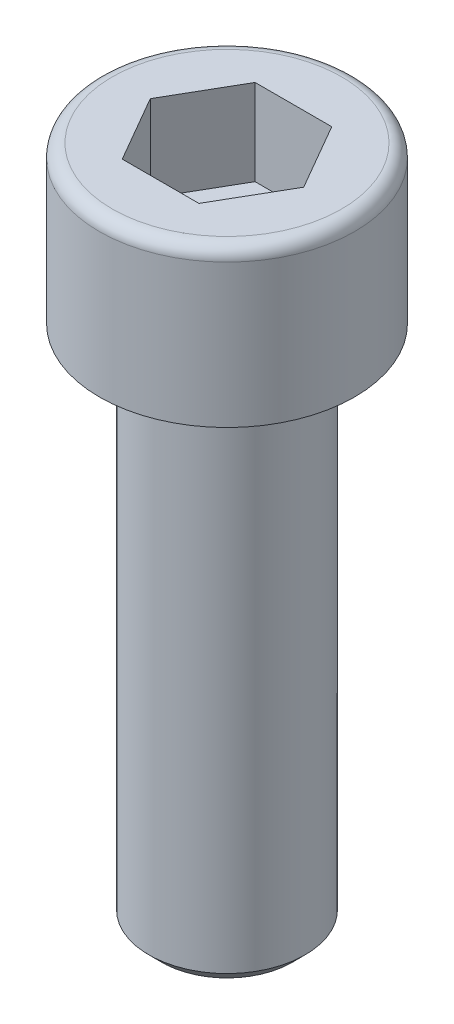
ISO-10303-21;
HEADER;
FILE_DESCRIPTION(('STEP AP214'),'2;1');
FILE_NAME('part.step','',(''),(''),'','','');
FILE_SCHEMA(('AUTOMOTIVE_DESIGN { 1 0 10303 214 1 1 1 1 }'));
ENDSEC;
DATA;
#1=APPLICATION_CONTEXT('core data for automotive mechanical design processes');
#2=APPLICATION_PROTOCOL_DEFINITION('international standard','automotive_design',2000,#1);
#3=PRODUCT_CONTEXT('',#1,'mechanical');
#4=PRODUCT('Part','Part','',(#3));
#5=PRODUCT_RELATED_PRODUCT_CATEGORY('part','',(#4));
#6=PRODUCT_DEFINITION_FORMATION('','',#4);
#7=PRODUCT_DEFINITION_CONTEXT('part definition',#1,'design');
#8=PRODUCT_DEFINITION('design','',#6,#7);
#9=PRODUCT_DEFINITION_SHAPE('','',#8);
#10=(LENGTH_UNIT() NAMED_UNIT(*) SI_UNIT(.MILLI.,.METRE.));
#11=(NAMED_UNIT(*) PLANE_ANGLE_UNIT() SI_UNIT($,.RADIAN.));
#12=(NAMED_UNIT(*) SI_UNIT($,.STERADIAN.) SOLID_ANGLE_UNIT());
#13=UNCERTAINTY_MEASURE_WITH_UNIT(LENGTH_MEASURE(1.E-05),#10,'distance_accuracy_value','');
#14=(GEOMETRIC_REPRESENTATION_CONTEXT(3) GLOBAL_UNCERTAINTY_ASSIGNED_CONTEXT((#13)) GLOBAL_UNIT_ASSIGNED_CONTEXT((#10,
#11,#12)) REPRESENTATION_CONTEXT('',''));
#15=CARTESIAN_POINT('',(0.,0.,0.));
#16=DIRECTION('',(0.,0.,1.));
#17=DIRECTION('',(1.,0.,0.));
#18=AXIS2_PLACEMENT_3D('',#15,#16,#17);
#19=CARTESIAN_POINT('',(0.,0.,0.));
#20=DIRECTION('',(0.,-1.,0.));
#21=DIRECTION('',(0.,0.,-1.));
#22=AXIS2_PLACEMENT_3D('',#19,#20,#21);
#23=PLANE('',#22);
#24=CARTESIAN_POINT('',(0.,0.,0.));
#25=DIRECTION('',(0.,-1.,0.));
#26=DIRECTION('',(0.,0.,-1.));
#27=AXIS2_PLACEMENT_3D('',#24,#25,#26);
#28=CIRCLE('',#27,4.9);
#29=CARTESIAN_POINT('',(0.,0.,-4.9));
#30=VERTEX_POINT('',#29);
#31=EDGE_CURVE('E142',#30,#30,#28,.T.);
#32=ORIENTED_EDGE('',*,*,#31,.T.);
#33=EDGE_LOOP('',(#32));
#34=FACE_BOUND('',#33,.T.);
#35=CARTESIAN_POINT('',(0.,0.,0.));
#36=DIRECTION('',(0.,-1.,0.));
#37=DIRECTION('',(0.,0.,-1.));
#38=AXIS2_PLACEMENT_3D('',#35,#36,#37);
#39=CIRCLE('',#38,3.);
#40=CARTESIAN_POINT('',(0.,0.,-3.));
#41=VERTEX_POINT('',#40);
#42=EDGE_CURVE('E134',#41,#41,#39,.T.);
#43=ORIENTED_EDGE('',*,*,#42,.F.);
#44=EDGE_LOOP('',(#43));
#45=FACE_BOUND('',#44,.T.);
#46=ADVANCED_FACE('F32',(#34,#45),#23,.T.);
#47=CARTESIAN_POINT('',(0.,6.,0.));
#48=DIRECTION('',(0.,-1.,0.));
#49=DIRECTION('',(0.,0.,-1.));
#50=AXIS2_PLACEMENT_3D('',#47,#48,#49);
#51=CYLINDRICAL_SURFACE('',#50,4.9);
#52=CARTESIAN_POINT('',(0.,5.5,0.));
#53=DIRECTION('',(0.,1.,0.));
#54=DIRECTION('',(0.,0.,1.));
#55=AXIS2_PLACEMENT_3D('',#52,#53,#54);
#56=CIRCLE('',#55,4.9);
#57=CARTESIAN_POINT('',(0.,5.5,4.9));
#58=VERTEX_POINT('',#57);
#59=EDGE_CURVE('E40',#58,#58,#56,.F.);
#60=ORIENTED_EDGE('',*,*,#59,.T.);
#61=EDGE_LOOP('',(#60));
#62=FACE_BOUND('',#61,.T.);
#63=ORIENTED_EDGE('',*,*,#31,.F.);
#64=EDGE_LOOP('',(#63));
#65=FACE_BOUND('',#64,.T.);
#66=ADVANCED_FACE('F153',(#62,#65),#51,.T.);
#67=CARTESIAN_POINT('',(4.9,6.,0.));
#68=DIRECTION('',(0.,1.,0.));
#69=DIRECTION('',(0.,0.,1.));
#70=AXIS2_PLACEMENT_3D('',#67,#68,#69);
#71=PLANE('',#70);
#72=CARTESIAN_POINT('',(0.,6.,0.));
#73=DIRECTION('',(0.,1.,0.));
#74=DIRECTION('',(0.,0.,1.));
#75=AXIS2_PLACEMENT_3D('',#72,#73,#74);
#76=CIRCLE('',#75,4.4);
#77=CARTESIAN_POINT('',(0.,6.,4.4));
#78=VERTEX_POINT('',#77);
#79=EDGE_CURVE('E11',#78,#78,#76,.T.);
#80=ORIENTED_EDGE('',*,*,#79,.T.);
#81=EDGE_LOOP('',(#80));
#82=FACE_BOUND('',#81,.T.);
#83=DIRECTION('',(0.499999999999999,0.,0.866025403784439));
#84=VECTOR('',#83,1.);
#85=CARTESIAN_POINT('',(-2.94448637286709,6.,0.));
#86=LINE('',#85,#84);
#87=CARTESIAN_POINT('',(-2.94448637286709,6.,0.));
#88=VERTEX_POINT('',#87);
#89=CARTESIAN_POINT('',(-1.47224318643355,6.,2.55));
#90=VERTEX_POINT('',#89);
#91=EDGE_CURVE('E47',#88,#90,#86,.T.);
#92=ORIENTED_EDGE('',*,*,#91,.F.);
#93=DIRECTION('',(-0.5,0.,0.866025403784439));
#94=VECTOR('',#93,1.);
#95=CARTESIAN_POINT('',(-1.47224318643354,6.,-2.55));
#96=LINE('',#95,#94);
#97=CARTESIAN_POINT('',(-1.47224318643354,6.,-2.55));
#98=VERTEX_POINT('',#97);
#99=EDGE_CURVE('E130',#98,#88,#96,.T.);
#100=ORIENTED_EDGE('',*,*,#99,.F.);
#101=DIRECTION('',(-1.,0.,0.));
#102=VECTOR('',#101,1.);
#103=CARTESIAN_POINT('',(1.47224318643355,6.,-2.55));
#104=LINE('',#103,#102);
#105=CARTESIAN_POINT('',(1.47224318643355,6.,-2.55));
#106=VERTEX_POINT('',#105);
#107=EDGE_CURVE('E128',#106,#98,#104,.T.);
#108=ORIENTED_EDGE('',*,*,#107,.F.);
#109=DIRECTION('',(-0.5,0.,-0.866025403784439));
#110=VECTOR('',#109,1.);
#111=CARTESIAN_POINT('',(2.94448637286709,6.,0.));
#112=LINE('',#111,#110);
#113=CARTESIAN_POINT('',(2.94448637286709,6.,0.));
#114=VERTEX_POINT('',#113);
#115=EDGE_CURVE('E95',#114,#106,#112,.T.);
#116=ORIENTED_EDGE('',*,*,#115,.F.);
#117=DIRECTION('',(0.5,0.,-0.866025403784439));
#118=VECTOR('',#117,1.);
#119=CARTESIAN_POINT('',(1.47224318643354,6.,2.55));
#120=LINE('',#119,#118);
#121=CARTESIAN_POINT('',(1.47224318643354,6.,2.55));
#122=VERTEX_POINT('',#121);
#123=EDGE_CURVE('E124',#122,#114,#120,.T.);
#124=ORIENTED_EDGE('',*,*,#123,.F.);
#125=DIRECTION('',(1.,0.,0.));
#126=VECTOR('',#125,1.);
#127=CARTESIAN_POINT('',(-1.47224318643355,6.,2.55));
#128=LINE('',#127,#126);
#129=EDGE_CURVE('E121',#90,#122,#128,.T.);
#130=ORIENTED_EDGE('',*,*,#129,.F.);
#131=EDGE_LOOP('',(#92,#100,#108,#116,#124,#130));
#132=FACE_BOUND('',#131,.T.);
#133=ADVANCED_FACE('F170',(#82,#132),#71,.T.);
#134=CARTESIAN_POINT('',(0.,-20.,0.));
#135=DIRECTION('',(0.,1.,0.));
#136=DIRECTION('',(0.,0.,1.));
#137=AXIS2_PLACEMENT_3D('',#134,#135,#136);
#138=CYLINDRICAL_SURFACE('',#137,3.);
#139=CARTESIAN_POINT('',(0.,-19.5,0.));
#140=DIRECTION('',(0.,-1.,0.));
#141=DIRECTION('',(0.,0.,-1.));
#142=AXIS2_PLACEMENT_3D('',#139,#140,#141);
#143=CIRCLE('',#142,3.);
#144=CARTESIAN_POINT('',(0.,-19.5,-3.));
#145=VERTEX_POINT('',#144);
#146=EDGE_CURVE('E148',#145,#145,#143,.F.);
#147=ORIENTED_EDGE('',*,*,#146,.T.);
#148=EDGE_LOOP('',(#147));
#149=FACE_BOUND('',#148,.T.);
#150=ORIENTED_EDGE('',*,*,#42,.T.);
#151=EDGE_LOOP('',(#150));
#152=FACE_BOUND('',#151,.T.);
#153=ADVANCED_FACE('F175',(#149,#152),#138,.T.);
#154=CARTESIAN_POINT('',(0.,-20.,0.));
#155=DIRECTION('',(0.,-1.,0.));
#156=DIRECTION('',(0.,0.,-1.));
#157=AXIS2_PLACEMENT_3D('',#154,#155,#156);
#158=PLANE('',#157);
#159=CARTESIAN_POINT('',(0.,-20.,0.));
#160=DIRECTION('',(0.,-1.,0.));
#161=DIRECTION('',(0.,0.,-1.));
#162=AXIS2_PLACEMENT_3D('',#159,#160,#161);
#163=CIRCLE('',#162,2.5);
#164=CARTESIAN_POINT('',(0.,-20.,-2.5));
#165=VERTEX_POINT('',#164);
#166=EDGE_CURVE('E145',#165,#165,#163,.T.);
#167=ORIENTED_EDGE('',*,*,#166,.T.);
#168=EDGE_LOOP('',(#167));
#169=FACE_BOUND('',#168,.T.);
#170=ADVANCED_FACE('F182',(#169),#158,.T.);
#171=CARTESIAN_POINT('',(-2.94448637286709,2.7,0.));
#172=DIRECTION('',(-0.866025403784439,0.,0.5));
#173=DIRECTION('',(0.5,0.,0.866025403784439));
#174=AXIS2_PLACEMENT_3D('',#171,#172,#173);
#175=PLANE('',#174);
#176=ORIENTED_EDGE('',*,*,#91,.T.);
#177=DIRECTION('',(0.,1.,0.));
#178=VECTOR('',#177,1.);
#179=CARTESIAN_POINT('',(-1.47224318643355,2.7,2.55));
#180=LINE('',#179,#178);
#181=CARTESIAN_POINT('',(-1.47224318643355,2.7,2.55));
#182=VERTEX_POINT('',#181);
#183=EDGE_CURVE('E77',#182,#90,#180,.T.);
#184=ORIENTED_EDGE('',*,*,#183,.F.);
#185=DIRECTION('',(0.499999999999999,0.,0.866025403784439));
#186=VECTOR('',#185,1.);
#187=CARTESIAN_POINT('',(-2.94448637286709,2.7,0.));
#188=LINE('',#187,#186);
#189=CARTESIAN_POINT('',(-2.94448637286709,2.7,0.));
#190=VERTEX_POINT('',#189);
#191=EDGE_CURVE('E132',#190,#182,#188,.T.);
#192=ORIENTED_EDGE('',*,*,#191,.F.);
#193=DIRECTION('',(0.,1.,0.));
#194=VECTOR('',#193,1.);
#195=CARTESIAN_POINT('',(-2.94448637286709,2.7,0.));
#196=LINE('',#195,#194);
#197=EDGE_CURVE('E55',#190,#88,#196,.T.);
#198=ORIENTED_EDGE('',*,*,#197,.T.);
#199=EDGE_LOOP('',(#176,#184,#192,#198));
#200=FACE_BOUND('',#199,.T.);
#201=ADVANCED_FACE('F191',(#200),#175,.F.);
#202=CARTESIAN_POINT('',(-1.47224318643354,2.7,-2.55));
#203=DIRECTION('',(-0.866025403784439,0.,-0.5));
#204=DIRECTION('',(-0.5,0.,0.866025403784439));
#205=AXIS2_PLACEMENT_3D('',#202,#203,#204);
#206=PLANE('',#205);
#207=ORIENTED_EDGE('',*,*,#99,.T.);
#208=ORIENTED_EDGE('',*,*,#197,.F.);
#209=DIRECTION('',(-0.5,0.,0.866025403784439));
#210=VECTOR('',#209,1.);
#211=CARTESIAN_POINT('',(-1.47224318643354,2.7,-2.55));
#212=LINE('',#211,#210);
#213=CARTESIAN_POINT('',(-1.47224318643354,2.7,-2.55));
#214=VERTEX_POINT('',#213);
#215=EDGE_CURVE('E107',#214,#190,#212,.T.);
#216=ORIENTED_EDGE('',*,*,#215,.F.);
#217=DIRECTION('',(0.,1.,0.));
#218=VECTOR('',#217,1.);
#219=CARTESIAN_POINT('',(-1.47224318643354,2.7,-2.55));
#220=LINE('',#219,#218);
#221=EDGE_CURVE('E99',#214,#98,#220,.T.);
#222=ORIENTED_EDGE('',*,*,#221,.T.);
#223=EDGE_LOOP('',(#207,#208,#216,#222));
#224=FACE_BOUND('',#223,.T.);
#225=ADVANCED_FACE('F193',(#224),#206,.F.);
#226=CARTESIAN_POINT('',(1.47224318643355,2.7,-2.55));
#227=DIRECTION('',(0.,0.,-1.));
#228=DIRECTION('',(-1.,0.,0.));
#229=AXIS2_PLACEMENT_3D('',#226,#227,#228);
#230=PLANE('',#229);
#231=ORIENTED_EDGE('',*,*,#107,.T.);
#232=ORIENTED_EDGE('',*,*,#221,.F.);
#233=DIRECTION('',(-1.,0.,0.));
#234=VECTOR('',#233,1.);
#235=CARTESIAN_POINT('',(1.47224318643355,2.7,-2.55));
#236=LINE('',#235,#234);
#237=CARTESIAN_POINT('',(1.47224318643355,2.7,-2.55));
#238=VERTEX_POINT('',#237);
#239=EDGE_CURVE('E103',#238,#214,#236,.T.);
#240=ORIENTED_EDGE('',*,*,#239,.F.);
#241=DIRECTION('',(0.,1.,0.));
#242=VECTOR('',#241,1.);
#243=CARTESIAN_POINT('',(1.47224318643355,2.7,-2.55));
#244=LINE('',#243,#242);
#245=EDGE_CURVE('E88',#238,#106,#244,.T.);
#246=ORIENTED_EDGE('',*,*,#245,.T.);
#247=EDGE_LOOP('',(#231,#232,#240,#246));
#248=FACE_BOUND('',#247,.T.);
#249=ADVANCED_FACE('F104',(#248),#230,.F.);
#250=CARTESIAN_POINT('',(2.94448637286709,2.7,0.));
#251=DIRECTION('',(0.866025403784439,0.,-0.5));
#252=DIRECTION('',(-0.5,0.,-0.866025403784439));
#253=AXIS2_PLACEMENT_3D('',#250,#251,#252);
#254=PLANE('',#253);
#255=ORIENTED_EDGE('',*,*,#115,.T.);
#256=ORIENTED_EDGE('',*,*,#245,.F.);
#257=DIRECTION('',(-0.5,0.,-0.866025403784439));
#258=VECTOR('',#257,1.);
#259=CARTESIAN_POINT('',(2.94448637286709,2.7,0.));
#260=LINE('',#259,#258);
#261=CARTESIAN_POINT('',(2.94448637286709,2.7,0.));
#262=VERTEX_POINT('',#261);
#263=EDGE_CURVE('E92',#262,#238,#260,.T.);
#264=ORIENTED_EDGE('',*,*,#263,.F.);
#265=DIRECTION('',(0.,1.,0.));
#266=VECTOR('',#265,1.);
#267=CARTESIAN_POINT('',(2.94448637286709,2.7,0.));
#268=LINE('',#267,#266);
#269=EDGE_CURVE('E100',#262,#114,#268,.T.);
#270=ORIENTED_EDGE('',*,*,#269,.T.);
#271=EDGE_LOOP('',(#255,#256,#264,#270));
#272=FACE_BOUND('',#271,.T.);
#273=ADVANCED_FACE('F90',(#272),#254,.F.);
#274=CARTESIAN_POINT('',(1.47224318643354,2.7,2.55));
#275=DIRECTION('',(0.866025403784439,0.,0.5));
#276=DIRECTION('',(0.5,0.,-0.866025403784439));
#277=AXIS2_PLACEMENT_3D('',#274,#275,#276);
#278=PLANE('',#277);
#279=ORIENTED_EDGE('',*,*,#123,.T.);
#280=ORIENTED_EDGE('',*,*,#269,.F.);
#281=DIRECTION('',(0.5,0.,-0.866025403784439));
#282=VECTOR('',#281,1.);
#283=CARTESIAN_POINT('',(1.47224318643354,2.7,2.55));
#284=LINE('',#283,#282);
#285=CARTESIAN_POINT('',(1.47224318643354,2.7,2.55));
#286=VERTEX_POINT('',#285);
#287=EDGE_CURVE('E113',#286,#262,#284,.T.);
#288=ORIENTED_EDGE('',*,*,#287,.F.);
#289=DIRECTION('',(0.,1.,0.));
#290=VECTOR('',#289,1.);
#291=CARTESIAN_POINT('',(1.47224318643354,2.7,2.55));
#292=LINE('',#291,#290);
#293=EDGE_CURVE('E137',#286,#122,#292,.T.);
#294=ORIENTED_EDGE('',*,*,#293,.T.);
#295=EDGE_LOOP('',(#279,#280,#288,#294));
#296=FACE_BOUND('',#295,.T.);
#297=ADVANCED_FACE('F204',(#296),#278,.F.);
#298=CARTESIAN_POINT('',(-1.47224318643355,2.7,2.55));
#299=DIRECTION('',(0.,0.,1.));
#300=DIRECTION('',(1.,0.,0.));
#301=AXIS2_PLACEMENT_3D('',#298,#299,#300);
#302=PLANE('',#301);
#303=ORIENTED_EDGE('',*,*,#129,.T.);
#304=ORIENTED_EDGE('',*,*,#293,.F.);
#305=DIRECTION('',(1.,0.,0.));
#306=VECTOR('',#305,1.);
#307=CARTESIAN_POINT('',(-1.47224318643355,2.7,2.55));
#308=LINE('',#307,#306);
#309=EDGE_CURVE('E115',#182,#286,#308,.T.);
#310=ORIENTED_EDGE('',*,*,#309,.F.);
#311=ORIENTED_EDGE('',*,*,#183,.T.);
#312=EDGE_LOOP('',(#303,#304,#310,#311));
#313=FACE_BOUND('',#312,.T.);
#314=ADVANCED_FACE('F189',(#313),#302,.F.);
#315=CARTESIAN_POINT('',(0.,2.7,0.));
#316=DIRECTION('',(0.,1.,0.));
#317=DIRECTION('',(0.,0.,1.));
#318=AXIS2_PLACEMENT_3D('',#315,#316,#317);
#319=PLANE('',#318);
#320=ORIENTED_EDGE('',*,*,#191,.T.);
#321=ORIENTED_EDGE('',*,*,#309,.T.);
#322=ORIENTED_EDGE('',*,*,#287,.T.);
#323=ORIENTED_EDGE('',*,*,#263,.T.);
#324=ORIENTED_EDGE('',*,*,#239,.T.);
#325=ORIENTED_EDGE('',*,*,#215,.T.);
#326=EDGE_LOOP('',(#320,#321,#322,#323,#324,#325));
#327=FACE_BOUND('',#326,.T.);
#328=ADVANCED_FACE('F110',(#327),#319,.T.);
#329=CARTESIAN_POINT('',(0.,-20.,0.));
#330=DIRECTION('',(0.,1.,0.));
#331=DIRECTION('',(0.,0.,1.));
#332=AXIS2_PLACEMENT_3D('',#329,#330,#331);
#333=CONICAL_SURFACE('',#332,2.5,0.785398163397442);
#334=ORIENTED_EDGE('',*,*,#146,.F.);
#335=EDGE_LOOP('',(#334));
#336=FACE_BOUND('',#335,.T.);
#337=ORIENTED_EDGE('',*,*,#166,.F.);
#338=EDGE_LOOP('',(#337));
#339=FACE_BOUND('',#338,.T.);
#340=ADVANCED_FACE('F157',(#336,#339),#333,.T.);
#341=CARTESIAN_POINT('',(0.,5.5,0.));
#342=DIRECTION('',(0.,1.,0.));
#343=DIRECTION('',(0.,0.,1.));
#344=AXIS2_PLACEMENT_3D('',#341,#342,#343);
#345=TOROIDAL_SURFACE('',#344,4.4,0.5);
#346=ORIENTED_EDGE('',*,*,#79,.F.);
#347=EDGE_LOOP('',(#346));
#348=FACE_BOUND('',#347,.T.);
#349=ORIENTED_EDGE('',*,*,#59,.F.);
#350=EDGE_LOOP('',(#349));
#351=FACE_BOUND('',#350,.T.);
#352=ADVANCED_FACE('F34',(#348,#351),#345,.T.);
#353=CLOSED_SHELL('',(#46,#66,#133,#153,#170,#201,#225,#249,#273,#297,#314,#328,#340,#352));
#354=MANIFOLD_SOLID_BREP('B2',#353);
#355=ADVANCED_BREP_SHAPE_REPRESENTATION('',(#18,#354),#14);
#356=SHAPE_DEFINITION_REPRESENTATION(#9,#355);
ENDSEC;
END-ISO-10303-21;
